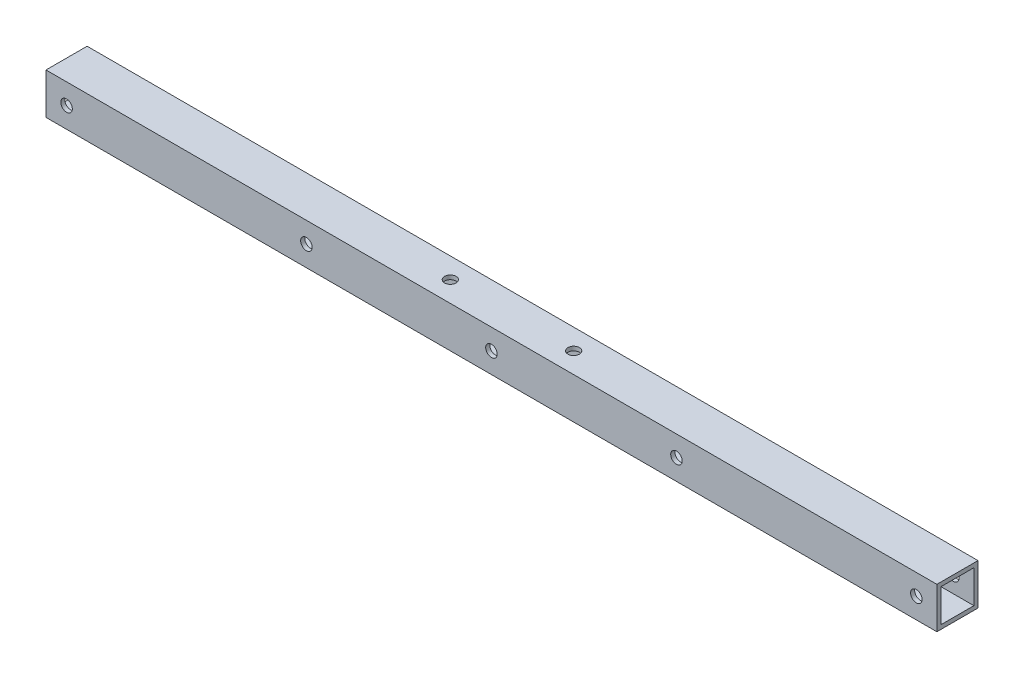
ISO-10303-21;
HEADER;
FILE_DESCRIPTION(('STEP AP214'),'2;1');
FILE_NAME('part.step','',(''),(''),'','','');
FILE_SCHEMA(('AUTOMOTIVE_DESIGN { 1 0 10303 214 1 1 1 1 }'));
ENDSEC;
DATA;
#1=APPLICATION_CONTEXT('core data for automotive mechanical design processes');
#2=APPLICATION_PROTOCOL_DEFINITION('international standard','automotive_design',2000,#1);
#3=PRODUCT_CONTEXT('',#1,'mechanical');
#4=PRODUCT('Part','Part','',(#3));
#5=PRODUCT_RELATED_PRODUCT_CATEGORY('part','',(#4));
#6=PRODUCT_DEFINITION_FORMATION('','',#4);
#7=PRODUCT_DEFINITION_CONTEXT('part definition',#1,'design');
#8=PRODUCT_DEFINITION('design','',#6,#7);
#9=PRODUCT_DEFINITION_SHAPE('','',#8);
#10=(LENGTH_UNIT() NAMED_UNIT(*) SI_UNIT(.MILLI.,.METRE.));
#11=(NAMED_UNIT(*) PLANE_ANGLE_UNIT() SI_UNIT($,.RADIAN.));
#12=(NAMED_UNIT(*) SI_UNIT($,.STERADIAN.) SOLID_ANGLE_UNIT());
#13=UNCERTAINTY_MEASURE_WITH_UNIT(LENGTH_MEASURE(1.E-05),#10,'distance_accuracy_value','');
#14=(GEOMETRIC_REPRESENTATION_CONTEXT(3) GLOBAL_UNCERTAINTY_ASSIGNED_CONTEXT((#13)) GLOBAL_UNIT_ASSIGNED_CONTEXT((#10,
#11,#12)) REPRESENTATION_CONTEXT('',''));
#15=CARTESIAN_POINT('',(0.,0.,0.));
#16=DIRECTION('',(0.,0.,1.));
#17=DIRECTION('',(1.,0.,0.));
#18=AXIS2_PLACEMENT_3D('',#15,#16,#17);
#19=CARTESIAN_POINT('',(325.,0.,0.));
#20=DIRECTION('',(1.,0.,0.));
#21=DIRECTION('',(0.,0.,-1.));
#22=AXIS2_PLACEMENT_3D('',#19,#20,#21);
#23=PLANE('',#22);
#24=DIRECTION('',(0.,1.,0.));
#25=VECTOR('',#24,1.);
#26=CARTESIAN_POINT('',(325.,7.5,-7.5));
#27=LINE('',#26,#25);
#28=CARTESIAN_POINT('',(325.,-7.5,-7.5));
#29=VERTEX_POINT('',#28);
#30=CARTESIAN_POINT('',(325.,7.5,-7.5));
#31=VERTEX_POINT('',#30);
#32=EDGE_CURVE('E164',#29,#31,#27,.T.);
#33=ORIENTED_EDGE('',*,*,#32,.T.);
#34=DIRECTION('',(0.,0.,1.));
#35=VECTOR('',#34,1.);
#36=CARTESIAN_POINT('',(325.,7.5,7.5));
#37=LINE('',#36,#35);
#38=CARTESIAN_POINT('',(325.,7.5,7.5));
#39=VERTEX_POINT('',#38);
#40=EDGE_CURVE('E167',#31,#39,#37,.T.);
#41=ORIENTED_EDGE('',*,*,#40,.T.);
#42=DIRECTION('',(0.,-1.,0.));
#43=VECTOR('',#42,1.);
#44=CARTESIAN_POINT('',(325.,7.5,7.5));
#45=LINE('',#44,#43);
#46=CARTESIAN_POINT('',(325.,-7.5,7.5));
#47=VERTEX_POINT('',#46);
#48=EDGE_CURVE('E170',#39,#47,#45,.T.);
#49=ORIENTED_EDGE('',*,*,#48,.T.);
#50=DIRECTION('',(0.,0.,-1.));
#51=VECTOR('',#50,1.);
#52=CARTESIAN_POINT('',(325.,-7.5,7.5));
#53=LINE('',#52,#51);
#54=EDGE_CURVE('E172',#47,#29,#53,.T.);
#55=ORIENTED_EDGE('',*,*,#54,.T.);
#56=EDGE_LOOP('',(#33,#41,#49,#55));
#57=FACE_BOUND('',#56,.T.);
#58=DIRECTION('',(0.,0.,1.));
#59=VECTOR('',#58,1.);
#60=CARTESIAN_POINT('',(325.,6.,7.5));
#61=LINE('',#60,#59);
#62=CARTESIAN_POINT('',(325.,6.,-6.));
#63=VERTEX_POINT('',#62);
#64=CARTESIAN_POINT('',(325.,6.,6.));
#65=VERTEX_POINT('',#64);
#66=EDGE_CURVE('E134',#63,#65,#61,.T.);
#67=ORIENTED_EDGE('',*,*,#66,.F.);
#68=DIRECTION('',(0.,1.,0.));
#69=VECTOR('',#68,1.);
#70=CARTESIAN_POINT('',(325.,7.5,-6.));
#71=LINE('',#70,#69);
#72=CARTESIAN_POINT('',(325.,-6.,-6.));
#73=VERTEX_POINT('',#72);
#74=EDGE_CURVE('E126',#73,#63,#71,.T.);
#75=ORIENTED_EDGE('',*,*,#74,.F.);
#76=DIRECTION('',(0.,0.,-1.));
#77=VECTOR('',#76,1.);
#78=CARTESIAN_POINT('',(325.,-6.,7.5));
#79=LINE('',#78,#77);
#80=CARTESIAN_POINT('',(325.,-6.,6.));
#81=VERTEX_POINT('',#80);
#82=EDGE_CURVE('E148',#81,#73,#79,.T.);
#83=ORIENTED_EDGE('',*,*,#82,.F.);
#84=DIRECTION('',(0.,-1.,0.));
#85=VECTOR('',#84,1.);
#86=CARTESIAN_POINT('',(325.,7.5,6.));
#87=LINE('',#86,#85);
#88=EDGE_CURVE('E146',#65,#81,#87,.T.);
#89=ORIENTED_EDGE('',*,*,#88,.F.);
#90=EDGE_LOOP('',(#67,#75,#83,#89));
#91=FACE_BOUND('',#90,.T.);
#92=ADVANCED_FACE('F59',(#57,#91),#23,.T.);
#93=CARTESIAN_POINT('',(0.,0.,0.));
#94=DIRECTION('',(1.,0.,0.));
#95=DIRECTION('',(0.,0.,-1.));
#96=AXIS2_PLACEMENT_3D('',#93,#94,#95);
#97=PLANE('',#96);
#98=DIRECTION('',(0.,1.,0.));
#99=VECTOR('',#98,1.);
#100=CARTESIAN_POINT('',(0.,7.5,-7.5));
#101=LINE('',#100,#99);
#102=CARTESIAN_POINT('',(0.,-7.5,-7.5));
#103=VERTEX_POINT('',#102);
#104=CARTESIAN_POINT('',(0.,7.5,-7.5));
#105=VERTEX_POINT('',#104);
#106=EDGE_CURVE('E142',#103,#105,#101,.T.);
#107=ORIENTED_EDGE('',*,*,#106,.F.);
#108=DIRECTION('',(0.,0.,-1.));
#109=VECTOR('',#108,1.);
#110=CARTESIAN_POINT('',(0.,-7.5,7.5));
#111=LINE('',#110,#109);
#112=CARTESIAN_POINT('',(0.,-7.5,7.5));
#113=VERTEX_POINT('',#112);
#114=EDGE_CURVE('E168',#113,#103,#111,.T.);
#115=ORIENTED_EDGE('',*,*,#114,.F.);
#116=DIRECTION('',(0.,-1.,0.));
#117=VECTOR('',#116,1.);
#118=CARTESIAN_POINT('',(0.,7.5,7.5));
#119=LINE('',#118,#117);
#120=CARTESIAN_POINT('',(0.,7.5,7.5));
#121=VERTEX_POINT('',#120);
#122=EDGE_CURVE('E179',#121,#113,#119,.T.);
#123=ORIENTED_EDGE('',*,*,#122,.F.);
#124=DIRECTION('',(0.,0.,1.));
#125=VECTOR('',#124,1.);
#126=CARTESIAN_POINT('',(0.,7.5,7.5));
#127=LINE('',#126,#125);
#128=EDGE_CURVE('E177',#105,#121,#127,.T.);
#129=ORIENTED_EDGE('',*,*,#128,.F.);
#130=EDGE_LOOP('',(#107,#115,#123,#129));
#131=FACE_BOUND('',#130,.T.);
#132=DIRECTION('',(0.,1.,0.));
#133=VECTOR('',#132,1.);
#134=CARTESIAN_POINT('',(0.,7.5,-6.));
#135=LINE('',#134,#133);
#136=CARTESIAN_POINT('',(0.,-6.,-6.));
#137=VERTEX_POINT('',#136);
#138=CARTESIAN_POINT('',(0.,6.,-6.));
#139=VERTEX_POINT('',#138);
#140=EDGE_CURVE('E84',#137,#139,#135,.T.);
#141=ORIENTED_EDGE('',*,*,#140,.T.);
#142=DIRECTION('',(0.,0.,1.));
#143=VECTOR('',#142,1.);
#144=CARTESIAN_POINT('',(0.,6.,7.5));
#145=LINE('',#144,#143);
#146=CARTESIAN_POINT('',(0.,6.,6.));
#147=VERTEX_POINT('',#146);
#148=EDGE_CURVE('E141',#139,#147,#145,.T.);
#149=ORIENTED_EDGE('',*,*,#148,.T.);
#150=DIRECTION('',(0.,-1.,0.));
#151=VECTOR('',#150,1.);
#152=CARTESIAN_POINT('',(0.,7.5,6.));
#153=LINE('',#152,#151);
#154=CARTESIAN_POINT('',(0.,-6.,6.));
#155=VERTEX_POINT('',#154);
#156=EDGE_CURVE('E156',#147,#155,#153,.T.);
#157=ORIENTED_EDGE('',*,*,#156,.T.);
#158=DIRECTION('',(0.,0.,-1.));
#159=VECTOR('',#158,1.);
#160=CARTESIAN_POINT('',(0.,-6.,7.5));
#161=LINE('',#160,#159);
#162=EDGE_CURVE('E135',#155,#137,#161,.T.);
#163=ORIENTED_EDGE('',*,*,#162,.T.);
#164=EDGE_LOOP('',(#141,#149,#157,#163));
#165=FACE_BOUND('',#164,.T.);
#166=ADVANCED_FACE('F293',(#131,#165),#97,.F.);
#167=CARTESIAN_POINT('',(325.,7.5,-7.5));
#168=DIRECTION('',(0.,0.,1.));
#169=DIRECTION('',(0.,-1.,0.));
#170=AXIS2_PLACEMENT_3D('',#167,#168,#169);
#171=PLANE('',#170);
#172=CARTESIAN_POINT('',(95.,0.,-7.5));
#173=DIRECTION('',(0.,0.,1.));
#174=DIRECTION('',(1.,0.,0.));
#175=AXIS2_PLACEMENT_3D('',#172,#173,#174);
#176=CIRCLE('',#175,2.10000000000002);
#177=CARTESIAN_POINT('',(97.1,0.,-7.5));
#178=VERTEX_POINT('',#177);
#179=EDGE_CURVE('E201',#178,#178,#176,.T.);
#180=ORIENTED_EDGE('',*,*,#179,.T.);
#181=EDGE_LOOP('',(#180));
#182=FACE_BOUND('',#181,.T.);
#183=CARTESIAN_POINT('',(230.,0.,-7.5));
#184=DIRECTION('',(0.,0.,1.));
#185=DIRECTION('',(-1.,0.,0.));
#186=AXIS2_PLACEMENT_3D('',#183,#184,#185);
#187=CIRCLE('',#186,2.09999999999999);
#188=CARTESIAN_POINT('',(227.9,0.,-7.5));
#189=VERTEX_POINT('',#188);
#190=EDGE_CURVE('E240',#189,#189,#187,.T.);
#191=ORIENTED_EDGE('',*,*,#190,.T.);
#192=EDGE_LOOP('',(#191));
#193=FACE_BOUND('',#192,.T.);
#194=CARTESIAN_POINT('',(162.5,0.,-7.5));
#195=DIRECTION('',(0.,0.,1.));
#196=DIRECTION('',(1.,0.,0.));
#197=AXIS2_PLACEMENT_3D('',#194,#195,#196);
#198=CIRCLE('',#197,2.09999999999999);
#199=CARTESIAN_POINT('',(164.6,0.,-7.5));
#200=VERTEX_POINT('',#199);
#201=EDGE_CURVE('E246',#200,#200,#198,.T.);
#202=ORIENTED_EDGE('',*,*,#201,.T.);
#203=EDGE_LOOP('',(#202));
#204=FACE_BOUND('',#203,.T.);
#205=CARTESIAN_POINT('',(7.5,0.,-7.5));
#206=DIRECTION('',(0.,0.,1.));
#207=DIRECTION('',(1.,0.,0.));
#208=AXIS2_PLACEMENT_3D('',#205,#206,#207);
#209=CIRCLE('',#208,2.1);
#210=CARTESIAN_POINT('',(9.6,0.,-7.5));
#211=VERTEX_POINT('',#210);
#212=EDGE_CURVE('E193',#211,#211,#209,.T.);
#213=ORIENTED_EDGE('',*,*,#212,.T.);
#214=EDGE_LOOP('',(#213));
#215=FACE_BOUND('',#214,.T.);
#216=CARTESIAN_POINT('',(317.5,0.,-7.5));
#217=DIRECTION('',(0.,0.,1.));
#218=DIRECTION('',(-1.,0.,0.));
#219=AXIS2_PLACEMENT_3D('',#216,#217,#218);
#220=CIRCLE('',#219,2.09999999999999);
#221=CARTESIAN_POINT('',(315.4,0.,-7.5));
#222=VERTEX_POINT('',#221);
#223=EDGE_CURVE('E263',#222,#222,#220,.T.);
#224=ORIENTED_EDGE('',*,*,#223,.T.);
#225=EDGE_LOOP('',(#224));
#226=FACE_BOUND('',#225,.T.);
#227=ORIENTED_EDGE('',*,*,#106,.T.);
#228=DIRECTION('',(-1.,0.,0.));
#229=VECTOR('',#228,1.);
#230=CARTESIAN_POINT('',(325.,7.5,-7.5));
#231=LINE('',#230,#229);
#232=EDGE_CURVE('E12',#31,#105,#231,.T.);
#233=ORIENTED_EDGE('',*,*,#232,.F.);
#234=ORIENTED_EDGE('',*,*,#32,.F.);
#235=DIRECTION('',(-1.,0.,0.));
#236=VECTOR('',#235,1.);
#237=CARTESIAN_POINT('',(325.,-7.5,-7.5));
#238=LINE('',#237,#236);
#239=EDGE_CURVE('E174',#29,#103,#238,.T.);
#240=ORIENTED_EDGE('',*,*,#239,.T.);
#241=EDGE_LOOP('',(#227,#233,#234,#240));
#242=FACE_BOUND('',#241,.T.);
#243=ADVANCED_FACE('F61',(#182,#193,#204,#215,#226,#242),#171,.F.);
#244=CARTESIAN_POINT('',(325.,7.5,7.5));
#245=DIRECTION('',(0.,-1.,0.));
#246=DIRECTION('',(0.,0.,-1.));
#247=AXIS2_PLACEMENT_3D('',#244,#245,#246);
#248=PLANE('',#247);
#249=CARTESIAN_POINT('',(140.,7.5,0.));
#250=DIRECTION('',(0.,1.,0.));
#251=DIRECTION('',(0.,0.,1.));
#252=AXIS2_PLACEMENT_3D('',#249,#250,#251);
#253=CIRCLE('',#252,2.09999999999999);
#254=CARTESIAN_POINT('',(140.,7.5,2.09999999999999));
#255=VERTEX_POINT('',#254);
#256=EDGE_CURVE('E218',#255,#255,#253,.T.);
#257=ORIENTED_EDGE('',*,*,#256,.F.);
#258=EDGE_LOOP('',(#257));
#259=FACE_BOUND('',#258,.T.);
#260=CARTESIAN_POINT('',(185.,7.5,0.));
#261=DIRECTION('',(0.,1.,0.));
#262=DIRECTION('',(0.,0.,-1.));
#263=AXIS2_PLACEMENT_3D('',#260,#261,#262);
#264=CIRCLE('',#263,2.09999999999999);
#265=CARTESIAN_POINT('',(185.,7.5,-2.09999999999999));
#266=VERTEX_POINT('',#265);
#267=EDGE_CURVE('E228',#266,#266,#264,.T.);
#268=ORIENTED_EDGE('',*,*,#267,.F.);
#269=EDGE_LOOP('',(#268));
#270=FACE_BOUND('',#269,.T.);
#271=ORIENTED_EDGE('',*,*,#128,.T.);
#272=DIRECTION('',(-1.,0.,0.));
#273=VECTOR('',#272,1.);
#274=CARTESIAN_POINT('',(325.,7.5,7.5));
#275=LINE('',#274,#273);
#276=EDGE_CURVE('E68',#39,#121,#275,.T.);
#277=ORIENTED_EDGE('',*,*,#276,.F.);
#278=ORIENTED_EDGE('',*,*,#40,.F.);
#279=ORIENTED_EDGE('',*,*,#232,.T.);
#280=EDGE_LOOP('',(#271,#277,#278,#279));
#281=FACE_BOUND('',#280,.T.);
#282=ADVANCED_FACE('F292',(#259,#270,#281),#248,.F.);
#283=CARTESIAN_POINT('',(325.,7.5,7.5));
#284=DIRECTION('',(0.,0.,-1.));
#285=DIRECTION('',(0.,1.,0.));
#286=AXIS2_PLACEMENT_3D('',#283,#284,#285);
#287=PLANE('',#286);
#288=CARTESIAN_POINT('',(95.,0.,7.5));
#289=DIRECTION('',(0.,0.,1.));
#290=DIRECTION('',(1.,0.,0.));
#291=AXIS2_PLACEMENT_3D('',#288,#289,#290);
#292=CIRCLE('',#291,2.10000000000002);
#293=CARTESIAN_POINT('',(97.1,0.,7.5));
#294=VERTEX_POINT('',#293);
#295=EDGE_CURVE('E237',#294,#294,#292,.T.);
#296=ORIENTED_EDGE('',*,*,#295,.F.);
#297=EDGE_LOOP('',(#296));
#298=FACE_BOUND('',#297,.T.);
#299=CARTESIAN_POINT('',(230.,0.,7.5));
#300=DIRECTION('',(0.,0.,1.));
#301=DIRECTION('',(-1.,0.,0.));
#302=AXIS2_PLACEMENT_3D('',#299,#300,#301);
#303=CIRCLE('',#302,2.09999999999999);
#304=CARTESIAN_POINT('',(227.9,0.,7.5));
#305=VERTEX_POINT('',#304);
#306=EDGE_CURVE('E243',#305,#305,#303,.T.);
#307=ORIENTED_EDGE('',*,*,#306,.F.);
#308=EDGE_LOOP('',(#307));
#309=FACE_BOUND('',#308,.T.);
#310=CARTESIAN_POINT('',(162.5,0.,7.5));
#311=DIRECTION('',(0.,0.,1.));
#312=DIRECTION('',(1.,0.,0.));
#313=AXIS2_PLACEMENT_3D('',#310,#311,#312);
#314=CIRCLE('',#313,2.09999999999999);
#315=CARTESIAN_POINT('',(164.6,0.,7.5));
#316=VERTEX_POINT('',#315);
#317=EDGE_CURVE('E234',#316,#316,#314,.T.);
#318=ORIENTED_EDGE('',*,*,#317,.F.);
#319=EDGE_LOOP('',(#318));
#320=FACE_BOUND('',#319,.T.);
#321=CARTESIAN_POINT('',(7.5,0.,7.5));
#322=DIRECTION('',(0.,0.,1.));
#323=DIRECTION('',(1.,0.,0.));
#324=AXIS2_PLACEMENT_3D('',#321,#322,#323);
#325=CIRCLE('',#324,2.1);
#326=CARTESIAN_POINT('',(9.6,0.,7.5));
#327=VERTEX_POINT('',#326);
#328=EDGE_CURVE('E260',#327,#327,#325,.T.);
#329=ORIENTED_EDGE('',*,*,#328,.F.);
#330=EDGE_LOOP('',(#329));
#331=FACE_BOUND('',#330,.T.);
#332=CARTESIAN_POINT('',(317.5,0.,7.5));
#333=DIRECTION('',(0.,0.,1.));
#334=DIRECTION('',(-1.,0.,0.));
#335=AXIS2_PLACEMENT_3D('',#332,#333,#334);
#336=CIRCLE('',#335,2.09999999999999);
#337=CARTESIAN_POINT('',(315.4,0.,7.5));
#338=VERTEX_POINT('',#337);
#339=EDGE_CURVE('E257',#338,#338,#336,.T.);
#340=ORIENTED_EDGE('',*,*,#339,.F.);
#341=EDGE_LOOP('',(#340));
#342=FACE_BOUND('',#341,.T.);
#343=ORIENTED_EDGE('',*,*,#122,.T.);
#344=DIRECTION('',(-1.,0.,0.));
#345=VECTOR('',#344,1.);
#346=CARTESIAN_POINT('',(325.,-7.5,7.5));
#347=LINE('',#346,#345);
#348=EDGE_CURVE('E184',#47,#113,#347,.T.);
#349=ORIENTED_EDGE('',*,*,#348,.F.);
#350=ORIENTED_EDGE('',*,*,#48,.F.);
#351=ORIENTED_EDGE('',*,*,#276,.T.);
#352=EDGE_LOOP('',(#343,#349,#350,#351));
#353=FACE_BOUND('',#352,.T.);
#354=ADVANCED_FACE('F311',(#298,#309,#320,#331,#342,#353),#287,.F.);
#355=CARTESIAN_POINT('',(325.,-7.5,7.5));
#356=DIRECTION('',(0.,1.,0.));
#357=DIRECTION('',(0.,0.,1.));
#358=AXIS2_PLACEMENT_3D('',#355,#356,#357);
#359=PLANE('',#358);
#360=CARTESIAN_POINT('',(140.,-7.5,0.));
#361=DIRECTION('',(0.,1.,0.));
#362=DIRECTION('',(0.,0.,1.));
#363=AXIS2_PLACEMENT_3D('',#360,#361,#362);
#364=CIRCLE('',#363,2.09999999999999);
#365=CARTESIAN_POINT('',(140.,-7.5,2.09999999999999));
#366=VERTEX_POINT('',#365);
#367=EDGE_CURVE('E212',#366,#366,#364,.T.);
#368=ORIENTED_EDGE('',*,*,#367,.T.);
#369=EDGE_LOOP('',(#368));
#370=FACE_BOUND('',#369,.T.);
#371=CARTESIAN_POINT('',(185.,-7.5,0.));
#372=DIRECTION('',(0.,1.,0.));
#373=DIRECTION('',(0.,0.,-1.));
#374=AXIS2_PLACEMENT_3D('',#371,#372,#373);
#375=CIRCLE('',#374,2.09999999999999);
#376=CARTESIAN_POINT('',(185.,-7.5,-2.09999999999999));
#377=VERTEX_POINT('',#376);
#378=EDGE_CURVE('E223',#377,#377,#375,.T.);
#379=ORIENTED_EDGE('',*,*,#378,.T.);
#380=EDGE_LOOP('',(#379));
#381=FACE_BOUND('',#380,.T.);
#382=ORIENTED_EDGE('',*,*,#114,.T.);
#383=ORIENTED_EDGE('',*,*,#239,.F.);
#384=ORIENTED_EDGE('',*,*,#54,.F.);
#385=ORIENTED_EDGE('',*,*,#348,.T.);
#386=EDGE_LOOP('',(#382,#383,#384,#385));
#387=FACE_BOUND('',#386,.T.);
#388=ADVANCED_FACE('F277',(#370,#381,#387),#359,.F.);
#389=CARTESIAN_POINT('',(325.,7.5,-6.));
#390=DIRECTION('',(0.,0.,1.));
#391=DIRECTION('',(0.,-1.,0.));
#392=AXIS2_PLACEMENT_3D('',#389,#390,#391);
#393=PLANE('',#392);
#394=CARTESIAN_POINT('',(95.,0.,-6.));
#395=DIRECTION('',(0.,0.,1.));
#396=DIRECTION('',(0.,-1.,0.));
#397=AXIS2_PLACEMENT_3D('',#394,#395,#396);
#398=CIRCLE('',#397,2.10000000000002);
#399=CARTESIAN_POINT('',(95.,-2.10000000000003,-6.));
#400=VERTEX_POINT('',#399);
#401=EDGE_CURVE('E208',#400,#400,#398,.T.);
#402=ORIENTED_EDGE('',*,*,#401,.F.);
#403=EDGE_LOOP('',(#402));
#404=FACE_BOUND('',#403,.T.);
#405=CARTESIAN_POINT('',(230.,0.,-6.));
#406=DIRECTION('',(0.,0.,1.));
#407=DIRECTION('',(0.,-1.,0.));
#408=AXIS2_PLACEMENT_3D('',#405,#406,#407);
#409=CIRCLE('',#408,2.09999999999999);
#410=CARTESIAN_POINT('',(230.,-2.09999999999998,-6.));
#411=VERTEX_POINT('',#410);
#412=EDGE_CURVE('E205',#411,#411,#409,.T.);
#413=ORIENTED_EDGE('',*,*,#412,.F.);
#414=EDGE_LOOP('',(#413));
#415=FACE_BOUND('',#414,.T.);
#416=CARTESIAN_POINT('',(162.5,0.,-6.));
#417=DIRECTION('',(0.,0.,1.));
#418=DIRECTION('',(0.,-1.,0.));
#419=AXIS2_PLACEMENT_3D('',#416,#417,#418);
#420=CIRCLE('',#419,2.09999999999999);
#421=CARTESIAN_POINT('',(162.5,-2.09999999999999,-6.));
#422=VERTEX_POINT('',#421);
#423=EDGE_CURVE('E200',#422,#422,#420,.T.);
#424=ORIENTED_EDGE('',*,*,#423,.F.);
#425=EDGE_LOOP('',(#424));
#426=FACE_BOUND('',#425,.T.);
#427=CARTESIAN_POINT('',(7.5,0.,-6.));
#428=DIRECTION('',(0.,0.,1.));
#429=DIRECTION('',(0.,-1.,0.));
#430=AXIS2_PLACEMENT_3D('',#427,#428,#429);
#431=CIRCLE('',#430,2.1);
#432=CARTESIAN_POINT('',(7.5,-2.1,-6.));
#433=VERTEX_POINT('',#432);
#434=EDGE_CURVE('E154',#433,#433,#431,.T.);
#435=ORIENTED_EDGE('',*,*,#434,.F.);
#436=EDGE_LOOP('',(#435));
#437=FACE_BOUND('',#436,.T.);
#438=CARTESIAN_POINT('',(317.5,0.,-6.));
#439=DIRECTION('',(0.,0.,1.));
#440=DIRECTION('',(0.,-1.,0.));
#441=AXIS2_PLACEMENT_3D('',#438,#439,#440);
#442=CIRCLE('',#441,2.09999999999999);
#443=CARTESIAN_POINT('',(317.5,-2.09999999999999,-6.));
#444=VERTEX_POINT('',#443);
#445=EDGE_CURVE('E192',#444,#444,#442,.T.);
#446=ORIENTED_EDGE('',*,*,#445,.F.);
#447=EDGE_LOOP('',(#446));
#448=FACE_BOUND('',#447,.T.);
#449=ORIENTED_EDGE('',*,*,#140,.F.);
#450=DIRECTION('',(-1.,0.,0.));
#451=VECTOR('',#450,1.);
#452=CARTESIAN_POINT('',(325.,-6.,-6.));
#453=LINE('',#452,#451);
#454=EDGE_CURVE('E130',#73,#137,#453,.T.);
#455=ORIENTED_EDGE('',*,*,#454,.F.);
#456=ORIENTED_EDGE('',*,*,#74,.T.);
#457=DIRECTION('',(-1.,0.,0.));
#458=VECTOR('',#457,1.);
#459=CARTESIAN_POINT('',(325.,6.,-6.));
#460=LINE('',#459,#458);
#461=EDGE_CURVE('E129',#63,#139,#460,.T.);
#462=ORIENTED_EDGE('',*,*,#461,.T.);
#463=EDGE_LOOP('',(#449,#455,#456,#462));
#464=FACE_BOUND('',#463,.T.);
#465=ADVANCED_FACE('F128',(#404,#415,#426,#437,#448,#464),#393,.T.);
#466=CARTESIAN_POINT('',(325.,6.,7.5));
#467=DIRECTION('',(0.,-1.,0.));
#468=DIRECTION('',(0.,0.,-1.));
#469=AXIS2_PLACEMENT_3D('',#466,#467,#468);
#470=PLANE('',#469);
#471=CARTESIAN_POINT('',(140.,6.,0.));
#472=DIRECTION('',(0.,-1.,0.));
#473=DIRECTION('',(0.,0.,-1.));
#474=AXIS2_PLACEMENT_3D('',#471,#472,#473);
#475=CIRCLE('',#474,2.09999999999999);
#476=CARTESIAN_POINT('',(140.,6.,-2.09999999999999));
#477=VERTEX_POINT('',#476);
#478=EDGE_CURVE('E231',#477,#477,#475,.T.);
#479=ORIENTED_EDGE('',*,*,#478,.F.);
#480=EDGE_LOOP('',(#479));
#481=FACE_BOUND('',#480,.T.);
#482=CARTESIAN_POINT('',(185.,6.,0.));
#483=DIRECTION('',(0.,-1.,0.));
#484=DIRECTION('',(0.,0.,-1.));
#485=AXIS2_PLACEMENT_3D('',#482,#483,#484);
#486=CIRCLE('',#485,2.09999999999999);
#487=CARTESIAN_POINT('',(185.,6.,-2.09999999999999));
#488=VERTEX_POINT('',#487);
#489=EDGE_CURVE('E211',#488,#488,#486,.T.);
#490=ORIENTED_EDGE('',*,*,#489,.F.);
#491=EDGE_LOOP('',(#490));
#492=FACE_BOUND('',#491,.T.);
#493=ORIENTED_EDGE('',*,*,#148,.F.);
#494=ORIENTED_EDGE('',*,*,#461,.F.);
#495=ORIENTED_EDGE('',*,*,#66,.T.);
#496=DIRECTION('',(-1.,0.,0.));
#497=VECTOR('',#496,1.);
#498=CARTESIAN_POINT('',(325.,6.,6.));
#499=LINE('',#498,#497);
#500=EDGE_CURVE('E143',#65,#147,#499,.T.);
#501=ORIENTED_EDGE('',*,*,#500,.T.);
#502=EDGE_LOOP('',(#493,#494,#495,#501));
#503=FACE_BOUND('',#502,.T.);
#504=ADVANCED_FACE('F138',(#481,#492,#503),#470,.T.);
#505=CARTESIAN_POINT('',(325.,7.5,6.));
#506=DIRECTION('',(0.,0.,-1.));
#507=DIRECTION('',(0.,1.,0.));
#508=AXIS2_PLACEMENT_3D('',#505,#506,#507);
#509=PLANE('',#508);
#510=CARTESIAN_POINT('',(95.,0.,6.));
#511=DIRECTION('',(0.,0.,-1.));
#512=DIRECTION('',(0.,1.,0.));
#513=AXIS2_PLACEMENT_3D('',#510,#511,#512);
#514=CIRCLE('',#513,2.10000000000002);
#515=CARTESIAN_POINT('',(95.,2.10000000000001,6.));
#516=VERTEX_POINT('',#515);
#517=EDGE_CURVE('E206',#516,#516,#514,.T.);
#518=ORIENTED_EDGE('',*,*,#517,.F.);
#519=EDGE_LOOP('',(#518));
#520=FACE_BOUND('',#519,.T.);
#521=CARTESIAN_POINT('',(230.,0.,6.));
#522=DIRECTION('',(0.,0.,-1.));
#523=DIRECTION('',(0.,1.,0.));
#524=AXIS2_PLACEMENT_3D('',#521,#522,#523);
#525=CIRCLE('',#524,2.09999999999999);
#526=CARTESIAN_POINT('',(230.,2.1,6.));
#527=VERTEX_POINT('',#526);
#528=EDGE_CURVE('E202',#527,#527,#525,.T.);
#529=ORIENTED_EDGE('',*,*,#528,.F.);
#530=EDGE_LOOP('',(#529));
#531=FACE_BOUND('',#530,.T.);
#532=CARTESIAN_POINT('',(162.5,0.,6.));
#533=DIRECTION('',(0.,0.,-1.));
#534=DIRECTION('',(0.,1.,0.));
#535=AXIS2_PLACEMENT_3D('',#532,#533,#534);
#536=CIRCLE('',#535,2.09999999999999);
#537=CARTESIAN_POINT('',(162.5,2.09999999999999,6.));
#538=VERTEX_POINT('',#537);
#539=EDGE_CURVE('E197',#538,#538,#536,.T.);
#540=ORIENTED_EDGE('',*,*,#539,.F.);
#541=EDGE_LOOP('',(#540));
#542=FACE_BOUND('',#541,.T.);
#543=CARTESIAN_POINT('',(7.5,0.,6.));
#544=DIRECTION('',(0.,0.,-1.));
#545=DIRECTION('',(0.,1.,0.));
#546=AXIS2_PLACEMENT_3D('',#543,#544,#545);
#547=CIRCLE('',#546,2.1);
#548=CARTESIAN_POINT('',(7.5,2.1,6.));
#549=VERTEX_POINT('',#548);
#550=EDGE_CURVE('E194',#549,#549,#547,.T.);
#551=ORIENTED_EDGE('',*,*,#550,.F.);
#552=EDGE_LOOP('',(#551));
#553=FACE_BOUND('',#552,.T.);
#554=CARTESIAN_POINT('',(317.5,0.,6.));
#555=DIRECTION('',(0.,0.,-1.));
#556=DIRECTION('',(0.,1.,0.));
#557=AXIS2_PLACEMENT_3D('',#554,#555,#556);
#558=CIRCLE('',#557,2.09999999999999);
#559=CARTESIAN_POINT('',(317.5,2.09999999999999,6.));
#560=VERTEX_POINT('',#559);
#561=EDGE_CURVE('E189',#560,#560,#558,.T.);
#562=ORIENTED_EDGE('',*,*,#561,.F.);
#563=EDGE_LOOP('',(#562));
#564=FACE_BOUND('',#563,.T.);
#565=ORIENTED_EDGE('',*,*,#156,.F.);
#566=ORIENTED_EDGE('',*,*,#500,.F.);
#567=ORIENTED_EDGE('',*,*,#88,.T.);
#568=DIRECTION('',(-1.,0.,0.));
#569=VECTOR('',#568,1.);
#570=CARTESIAN_POINT('',(325.,-6.,6.));
#571=LINE('',#570,#569);
#572=EDGE_CURVE('E76',#81,#155,#571,.T.);
#573=ORIENTED_EDGE('',*,*,#572,.T.);
#574=EDGE_LOOP('',(#565,#566,#567,#573));
#575=FACE_BOUND('',#574,.T.);
#576=ADVANCED_FACE('F332',(#520,#531,#542,#553,#564,#575),#509,.T.);
#577=CARTESIAN_POINT('',(325.,-6.,7.5));
#578=DIRECTION('',(0.,1.,0.));
#579=DIRECTION('',(0.,0.,1.));
#580=AXIS2_PLACEMENT_3D('',#577,#578,#579);
#581=PLANE('',#580);
#582=CARTESIAN_POINT('',(140.,-6.,0.));
#583=DIRECTION('',(0.,1.,0.));
#584=DIRECTION('',(0.,0.,1.));
#585=AXIS2_PLACEMENT_3D('',#582,#583,#584);
#586=CIRCLE('',#585,2.09999999999999);
#587=CARTESIAN_POINT('',(140.,-6.,2.09999999999999));
#588=VERTEX_POINT('',#587);
#589=EDGE_CURVE('E63',#588,#588,#586,.T.);
#590=ORIENTED_EDGE('',*,*,#589,.F.);
#591=EDGE_LOOP('',(#590));
#592=FACE_BOUND('',#591,.T.);
#593=CARTESIAN_POINT('',(185.,-6.,0.));
#594=DIRECTION('',(0.,1.,0.));
#595=DIRECTION('',(0.,0.,1.));
#596=AXIS2_PLACEMENT_3D('',#593,#594,#595);
#597=CIRCLE('',#596,2.09999999999999);
#598=CARTESIAN_POINT('',(185.,-6.,2.09999999999999));
#599=VERTEX_POINT('',#598);
#600=EDGE_CURVE('E209',#599,#599,#597,.T.);
#601=ORIENTED_EDGE('',*,*,#600,.F.);
#602=EDGE_LOOP('',(#601));
#603=FACE_BOUND('',#602,.T.);
#604=ORIENTED_EDGE('',*,*,#162,.F.);
#605=ORIENTED_EDGE('',*,*,#572,.F.);
#606=ORIENTED_EDGE('',*,*,#82,.T.);
#607=ORIENTED_EDGE('',*,*,#454,.T.);
#608=EDGE_LOOP('',(#604,#605,#606,#607));
#609=FACE_BOUND('',#608,.T.);
#610=ADVANCED_FACE('F336',(#592,#603,#609),#581,.T.);
#611=CARTESIAN_POINT('',(317.5,0.,-7.5));
#612=DIRECTION('',(0.,0.,1.));
#613=DIRECTION('',(1.,0.,0.));
#614=AXIS2_PLACEMENT_3D('',#611,#612,#613);
#615=CYLINDRICAL_SURFACE('',#614,2.09999999999999);
#616=ORIENTED_EDGE('',*,*,#561,.T.);
#617=EDGE_LOOP('',(#616));
#618=FACE_BOUND('',#617,.T.);
#619=ORIENTED_EDGE('',*,*,#339,.T.);
#620=EDGE_LOOP('',(#619));
#621=FACE_BOUND('',#620,.T.);
#622=ADVANCED_FACE('F287',(#618,#621),#615,.F.);
#623=CARTESIAN_POINT('',(7.5,0.,-7.5));
#624=DIRECTION('',(0.,0.,1.));
#625=DIRECTION('',(1.,0.,0.));
#626=AXIS2_PLACEMENT_3D('',#623,#624,#625);
#627=CYLINDRICAL_SURFACE('',#626,2.1);
#628=ORIENTED_EDGE('',*,*,#550,.T.);
#629=EDGE_LOOP('',(#628));
#630=FACE_BOUND('',#629,.T.);
#631=ORIENTED_EDGE('',*,*,#328,.T.);
#632=EDGE_LOOP('',(#631));
#633=FACE_BOUND('',#632,.T.);
#634=ADVANCED_FACE('F285',(#630,#633),#627,.F.);
#635=ORIENTED_EDGE('',*,*,#445,.T.);
#636=EDGE_LOOP('',(#635));
#637=FACE_BOUND('',#636,.T.);
#638=ORIENTED_EDGE('',*,*,#223,.F.);
#639=EDGE_LOOP('',(#638));
#640=FACE_BOUND('',#639,.T.);
#641=ADVANCED_FACE('F282',(#637,#640),#615,.F.);
#642=ORIENTED_EDGE('',*,*,#434,.T.);
#643=EDGE_LOOP('',(#642));
#644=FACE_BOUND('',#643,.T.);
#645=ORIENTED_EDGE('',*,*,#212,.F.);
#646=EDGE_LOOP('',(#645));
#647=FACE_BOUND('',#646,.T.);
#648=ADVANCED_FACE('F272',(#644,#647),#627,.F.);
#649=CARTESIAN_POINT('',(162.5,0.,-7.5));
#650=DIRECTION('',(0.,0.,1.));
#651=DIRECTION('',(1.,0.,0.));
#652=AXIS2_PLACEMENT_3D('',#649,#650,#651);
#653=CYLINDRICAL_SURFACE('',#652,2.09999999999999);
#654=ORIENTED_EDGE('',*,*,#539,.T.);
#655=EDGE_LOOP('',(#654));
#656=FACE_BOUND('',#655,.T.);
#657=ORIENTED_EDGE('',*,*,#317,.T.);
#658=EDGE_LOOP('',(#657));
#659=FACE_BOUND('',#658,.T.);
#660=ADVANCED_FACE('F346',(#656,#659),#653,.F.);
#661=CARTESIAN_POINT('',(230.,0.,-7.5));
#662=DIRECTION('',(0.,0.,1.));
#663=DIRECTION('',(1.,0.,0.));
#664=AXIS2_PLACEMENT_3D('',#661,#662,#663);
#665=CYLINDRICAL_SURFACE('',#664,2.09999999999999);
#666=ORIENTED_EDGE('',*,*,#528,.T.);
#667=EDGE_LOOP('',(#666));
#668=FACE_BOUND('',#667,.T.);
#669=ORIENTED_EDGE('',*,*,#306,.T.);
#670=EDGE_LOOP('',(#669));
#671=FACE_BOUND('',#670,.T.);
#672=ADVANCED_FACE('F349',(#668,#671),#665,.F.);
#673=CARTESIAN_POINT('',(95.,0.,-7.5));
#674=DIRECTION('',(0.,0.,1.));
#675=DIRECTION('',(1.,0.,0.));
#676=AXIS2_PLACEMENT_3D('',#673,#674,#675);
#677=CYLINDRICAL_SURFACE('',#676,2.10000000000002);
#678=ORIENTED_EDGE('',*,*,#517,.T.);
#679=EDGE_LOOP('',(#678));
#680=FACE_BOUND('',#679,.T.);
#681=ORIENTED_EDGE('',*,*,#295,.T.);
#682=EDGE_LOOP('',(#681));
#683=FACE_BOUND('',#682,.T.);
#684=ADVANCED_FACE('F354',(#680,#683),#677,.F.);
#685=ORIENTED_EDGE('',*,*,#423,.T.);
#686=EDGE_LOOP('',(#685));
#687=FACE_BOUND('',#686,.T.);
#688=ORIENTED_EDGE('',*,*,#201,.F.);
#689=EDGE_LOOP('',(#688));
#690=FACE_BOUND('',#689,.T.);
#691=ADVANCED_FACE('F351',(#687,#690),#653,.F.);
#692=ORIENTED_EDGE('',*,*,#412,.T.);
#693=EDGE_LOOP('',(#692));
#694=FACE_BOUND('',#693,.T.);
#695=ORIENTED_EDGE('',*,*,#190,.F.);
#696=EDGE_LOOP('',(#695));
#697=FACE_BOUND('',#696,.T.);
#698=ADVANCED_FACE('F356',(#694,#697),#665,.F.);
#699=ORIENTED_EDGE('',*,*,#401,.T.);
#700=EDGE_LOOP('',(#699));
#701=FACE_BOUND('',#700,.T.);
#702=ORIENTED_EDGE('',*,*,#179,.F.);
#703=EDGE_LOOP('',(#702));
#704=FACE_BOUND('',#703,.T.);
#705=ADVANCED_FACE('F360',(#701,#704),#677,.F.);
#706=CARTESIAN_POINT('',(185.,-7.5,0.));
#707=DIRECTION('',(0.,1.,0.));
#708=DIRECTION('',(0.,0.,1.));
#709=AXIS2_PLACEMENT_3D('',#706,#707,#708);
#710=CYLINDRICAL_SURFACE('',#709,2.09999999999999);
#711=ORIENTED_EDGE('',*,*,#600,.T.);
#712=EDGE_LOOP('',(#711));
#713=FACE_BOUND('',#712,.T.);
#714=ORIENTED_EDGE('',*,*,#378,.F.);
#715=EDGE_LOOP('',(#714));
#716=FACE_BOUND('',#715,.T.);
#717=ADVANCED_FACE('F361',(#713,#716),#710,.F.);
#718=CARTESIAN_POINT('',(140.,-7.5,0.));
#719=DIRECTION('',(0.,1.,0.));
#720=DIRECTION('',(0.,0.,1.));
#721=AXIS2_PLACEMENT_3D('',#718,#719,#720);
#722=CYLINDRICAL_SURFACE('',#721,2.09999999999999);
#723=ORIENTED_EDGE('',*,*,#589,.T.);
#724=EDGE_LOOP('',(#723));
#725=FACE_BOUND('',#724,.T.);
#726=ORIENTED_EDGE('',*,*,#367,.F.);
#727=EDGE_LOOP('',(#726));
#728=FACE_BOUND('',#727,.T.);
#729=ADVANCED_FACE('F364',(#725,#728),#722,.F.);
#730=ORIENTED_EDGE('',*,*,#489,.T.);
#731=EDGE_LOOP('',(#730));
#732=FACE_BOUND('',#731,.T.);
#733=ORIENTED_EDGE('',*,*,#267,.T.);
#734=EDGE_LOOP('',(#733));
#735=FACE_BOUND('',#734,.T.);
#736=ADVANCED_FACE('F365',(#732,#735),#710,.F.);
#737=ORIENTED_EDGE('',*,*,#478,.T.);
#738=EDGE_LOOP('',(#737));
#739=FACE_BOUND('',#738,.T.);
#740=ORIENTED_EDGE('',*,*,#256,.T.);
#741=EDGE_LOOP('',(#740));
#742=FACE_BOUND('',#741,.T.);
#743=ADVANCED_FACE('F368',(#739,#742),#722,.F.);
#744=CLOSED_SHELL('',(#92,#166,#243,#282,#354,#388,#465,#504,#576,#610,#622,#634,#641,#648,#660,
#672,#684,#691,#698,#705,#717,#729,#736,#743));
#745=MANIFOLD_SOLID_BREP('B2',#744);
#746=ADVANCED_BREP_SHAPE_REPRESENTATION('',(#18,#745),#14);
#747=SHAPE_DEFINITION_REPRESENTATION(#9,#746);
ENDSEC;
END-ISO-10303-21;
